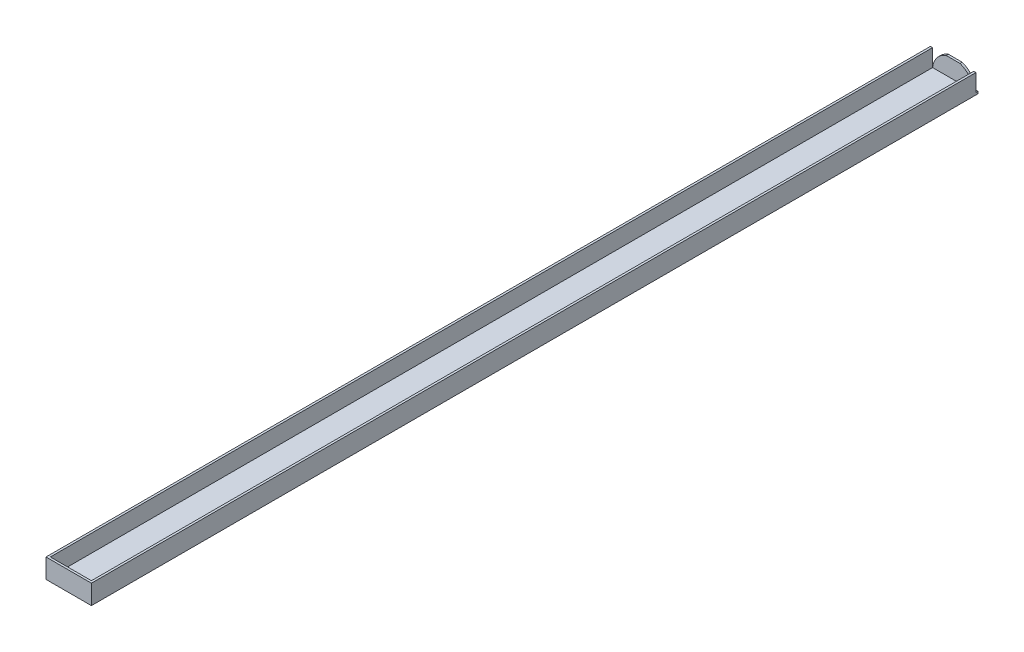
ISO-10303-21;
HEADER;
FILE_DESCRIPTION(('STEP AP214'),'2;1');
FILE_NAME('part.step','',(''),(''),'','','');
FILE_SCHEMA(('AUTOMOTIVE_DESIGN { 1 0 10303 214 1 1 1 1 }'));
ENDSEC;
DATA;
#1=APPLICATION_CONTEXT('core data for automotive mechanical design processes');
#2=APPLICATION_PROTOCOL_DEFINITION('international standard','automotive_design',2000,#1);
#3=PRODUCT_CONTEXT('',#1,'mechanical');
#4=PRODUCT('Part','Part','',(#3));
#5=PRODUCT_RELATED_PRODUCT_CATEGORY('part','',(#4));
#6=PRODUCT_DEFINITION_FORMATION('','',#4);
#7=PRODUCT_DEFINITION_CONTEXT('part definition',#1,'design');
#8=PRODUCT_DEFINITION('design','',#6,#7);
#9=PRODUCT_DEFINITION_SHAPE('','',#8);
#10=(LENGTH_UNIT() NAMED_UNIT(*) SI_UNIT(.MILLI.,.METRE.));
#11=(NAMED_UNIT(*) PLANE_ANGLE_UNIT() SI_UNIT($,.RADIAN.));
#12=(NAMED_UNIT(*) SI_UNIT($,.STERADIAN.) SOLID_ANGLE_UNIT());
#13=UNCERTAINTY_MEASURE_WITH_UNIT(LENGTH_MEASURE(1.E-05),#10,'distance_accuracy_value','');
#14=(GEOMETRIC_REPRESENTATION_CONTEXT(3) GLOBAL_UNCERTAINTY_ASSIGNED_CONTEXT((#13)) GLOBAL_UNIT_ASSIGNED_CONTEXT((#10,
#11,#12)) REPRESENTATION_CONTEXT('',''));
#15=CARTESIAN_POINT('',(0.,0.,0.));
#16=DIRECTION('',(0.,0.,1.));
#17=DIRECTION('',(1.,0.,0.));
#18=AXIS2_PLACEMENT_3D('',#15,#16,#17);
#19=CARTESIAN_POINT('',(0.,0.,410.));
#20=DIRECTION('',(0.,-1.,0.));
#21=DIRECTION('',(0.,0.,-1.));
#22=AXIS2_PLACEMENT_3D('',#19,#20,#21);
#23=PLANE('',#22);
#24=DIRECTION('',(-1.,0.,0.));
#25=VECTOR('',#24,1.);
#26=CARTESIAN_POINT('',(1.,0.,1.));
#27=LINE('',#26,#25);
#28=CARTESIAN_POINT('',(13.682887931237,0.,1.));
#29=VERTEX_POINT('',#28);
#30=CARTESIAN_POINT('',(7.31711206876305,0.,1.));
#31=VERTEX_POINT('',#30);
#32=EDGE_CURVE('E252',#29,#31,#27,.T.);
#33=ORIENTED_EDGE('',*,*,#32,.F.);
#34=DIRECTION('',(0.,0.,-1.));
#35=VECTOR('',#34,1.);
#36=CARTESIAN_POINT('',(13.682887931237,0.,8.));
#37=LINE('',#36,#35);
#38=CARTESIAN_POINT('',(13.682887931237,0.,0.));
#39=VERTEX_POINT('',#38);
#40=EDGE_CURVE('E230',#29,#39,#37,.T.);
#41=ORIENTED_EDGE('',*,*,#40,.T.);
#42=DIRECTION('',(-1.,0.,0.));
#43=VECTOR('',#42,1.);
#44=CARTESIAN_POINT('',(0.,0.,0.));
#45=LINE('',#44,#43);
#46=CARTESIAN_POINT('',(7.31711206876305,0.,0.));
#47=VERTEX_POINT('',#46);
#48=EDGE_CURVE('E193',#39,#47,#45,.T.);
#49=ORIENTED_EDGE('',*,*,#48,.T.);
#50=DIRECTION('',(0.,0.,-1.));
#51=VECTOR('',#50,1.);
#52=CARTESIAN_POINT('',(7.31711206876305,0.,8.));
#53=LINE('',#52,#51);
#54=EDGE_CURVE('E318',#31,#47,#53,.T.);
#55=ORIENTED_EDGE('',*,*,#54,.F.);
#56=EDGE_LOOP('',(#33,#41,#49,#55));
#57=FACE_BOUND('',#56,.T.);
#58=ADVANCED_FACE('F35',(#57),#23,.F.);
#59=CARTESIAN_POINT('',(0.,0.,410.));
#60=DIRECTION('',(1.,0.,0.));
#61=DIRECTION('',(0.,1.,0.));
#62=AXIS2_PLACEMENT_3D('',#59,#60,#61);
#63=PLANE('',#62);
#64=DIRECTION('',(0.,0.,-1.));
#65=VECTOR('',#64,1.);
#66=CARTESIAN_POINT('',(0.,0.,410.));
#67=LINE('',#66,#65);
#68=CARTESIAN_POINT('',(0.,0.,410.));
#69=VERTEX_POINT('',#68);
#70=CARTESIAN_POINT('',(0.,0.,1.));
#71=VERTEX_POINT('',#70);
#72=EDGE_CURVE('E197',#69,#71,#67,.T.);
#73=ORIENTED_EDGE('',*,*,#72,.T.);
#74=DIRECTION('',(0.,1.,0.));
#75=VECTOR('',#74,1.);
#76=CARTESIAN_POINT('',(0.,0.,1.));
#77=LINE('',#76,#75);
#78=CARTESIAN_POINT('',(0.,-8.,1.));
#79=VERTEX_POINT('',#78);
#80=EDGE_CURVE('E169',#79,#71,#77,.T.);
#81=ORIENTED_EDGE('',*,*,#80,.F.);
#82=DIRECTION('',(0.,0.,1.));
#83=VECTOR('',#82,1.);
#84=CARTESIAN_POINT('',(0.,-8.,0.));
#85=LINE('',#84,#83);
#86=CARTESIAN_POINT('',(0.,-8.,0.));
#87=VERTEX_POINT('',#86);
#88=EDGE_CURVE('E161',#87,#79,#85,.T.);
#89=ORIENTED_EDGE('',*,*,#88,.F.);
#90=DIRECTION('',(0.,-1.,0.));
#91=VECTOR('',#90,1.);
#92=CARTESIAN_POINT('',(0.,0.,0.));
#93=LINE('',#92,#91);
#94=CARTESIAN_POINT('',(0.,-9.,0.));
#95=VERTEX_POINT('',#94);
#96=EDGE_CURVE('E174',#87,#95,#93,.T.);
#97=ORIENTED_EDGE('',*,*,#96,.T.);
#98=DIRECTION('',(0.,0.,-1.));
#99=VECTOR('',#98,1.);
#100=CARTESIAN_POINT('',(0.,-9.,410.));
#101=LINE('',#100,#99);
#102=CARTESIAN_POINT('',(0.,-9.,410.));
#103=VERTEX_POINT('',#102);
#104=EDGE_CURVE('E205',#103,#95,#101,.T.);
#105=ORIENTED_EDGE('',*,*,#104,.F.);
#106=DIRECTION('',(0.,-1.,0.));
#107=VECTOR('',#106,1.);
#108=CARTESIAN_POINT('',(0.,0.,410.));
#109=LINE('',#108,#107);
#110=EDGE_CURVE('E196',#69,#103,#109,.T.);
#111=ORIENTED_EDGE('',*,*,#110,.F.);
#112=EDGE_LOOP('',(#73,#81,#89,#97,#105,#111));
#113=FACE_BOUND('',#112,.T.);
#114=ADVANCED_FACE('F37',(#113),#63,.F.);
#115=CARTESIAN_POINT('',(0.,-9.,410.));
#116=DIRECTION('',(0.,1.,0.));
#117=DIRECTION('',(0.,0.,1.));
#118=AXIS2_PLACEMENT_3D('',#115,#116,#117);
#119=PLANE('',#118);
#120=DIRECTION('',(1.,0.,0.));
#121=VECTOR('',#120,1.);
#122=CARTESIAN_POINT('',(0.,-9.,0.));
#123=LINE('',#122,#121);
#124=CARTESIAN_POINT('',(21.,-9.,0.));
#125=VERTEX_POINT('',#124);
#126=EDGE_CURVE('E179',#95,#125,#123,.T.);
#127=ORIENTED_EDGE('',*,*,#126,.T.);
#128=DIRECTION('',(0.,0.,-1.));
#129=VECTOR('',#128,1.);
#130=CARTESIAN_POINT('',(21.,-9.,410.));
#131=LINE('',#130,#129);
#132=CARTESIAN_POINT('',(21.,-9.,410.));
#133=VERTEX_POINT('',#132);
#134=EDGE_CURVE('E202',#133,#125,#131,.T.);
#135=ORIENTED_EDGE('',*,*,#134,.F.);
#136=DIRECTION('',(1.,0.,0.));
#137=VECTOR('',#136,1.);
#138=CARTESIAN_POINT('',(0.,-9.,410.));
#139=LINE('',#138,#137);
#140=EDGE_CURVE('E259',#103,#133,#139,.T.);
#141=ORIENTED_EDGE('',*,*,#140,.F.);
#142=ORIENTED_EDGE('',*,*,#104,.T.);
#143=EDGE_LOOP('',(#127,#135,#141,#142));
#144=FACE_BOUND('',#143,.T.);
#145=ADVANCED_FACE('F274',(#144),#119,.F.);
#146=CARTESIAN_POINT('',(21.,0.,410.));
#147=DIRECTION('',(-1.,0.,0.));
#148=DIRECTION('',(0.,-1.,0.));
#149=AXIS2_PLACEMENT_3D('',#146,#147,#148);
#150=PLANE('',#149);
#151=DIRECTION('',(0.,1.,0.));
#152=VECTOR('',#151,1.);
#153=CARTESIAN_POINT('',(21.,0.,0.));
#154=LINE('',#153,#152);
#155=CARTESIAN_POINT('',(21.,-8.,0.));
#156=VERTEX_POINT('',#155);
#157=EDGE_CURVE('E183',#125,#156,#154,.T.);
#158=ORIENTED_EDGE('',*,*,#157,.T.);
#159=DIRECTION('',(0.,0.,-1.));
#160=VECTOR('',#159,1.);
#161=CARTESIAN_POINT('',(21.,-8.,0.));
#162=LINE('',#161,#160);
#163=CARTESIAN_POINT('',(21.,-8.,0.999999999999999));
#164=VERTEX_POINT('',#163);
#165=EDGE_CURVE('E285',#164,#156,#162,.T.);
#166=ORIENTED_EDGE('',*,*,#165,.F.);
#167=DIRECTION('',(0.,-1.,0.));
#168=VECTOR('',#167,1.);
#169=CARTESIAN_POINT('',(21.,0.,1.));
#170=LINE('',#169,#168);
#171=CARTESIAN_POINT('',(21.,0.,1.));
#172=VERTEX_POINT('',#171);
#173=EDGE_CURVE('E280',#172,#164,#170,.T.);
#174=ORIENTED_EDGE('',*,*,#173,.F.);
#175=DIRECTION('',(0.,0.,-1.));
#176=VECTOR('',#175,1.);
#177=CARTESIAN_POINT('',(21.,0.,410.));
#178=LINE('',#177,#176);
#179=CARTESIAN_POINT('',(21.,0.,410.));
#180=VERTEX_POINT('',#179);
#181=EDGE_CURVE('E199',#180,#172,#178,.T.);
#182=ORIENTED_EDGE('',*,*,#181,.F.);
#183=DIRECTION('',(0.,1.,0.));
#184=VECTOR('',#183,1.);
#185=CARTESIAN_POINT('',(21.,0.,410.));
#186=LINE('',#185,#184);
#187=EDGE_CURVE('E260',#133,#180,#186,.T.);
#188=ORIENTED_EDGE('',*,*,#187,.F.);
#189=ORIENTED_EDGE('',*,*,#134,.T.);
#190=EDGE_LOOP('',(#158,#166,#174,#182,#188,#189));
#191=FACE_BOUND('',#190,.T.);
#192=ADVANCED_FACE('F277',(#191),#150,.F.);
#193=DIRECTION('',(0.,0.,1.));
#194=VECTOR('',#193,1.);
#195=CARTESIAN_POINT('',(1.,0.,1.));
#196=LINE('',#195,#194);
#197=CARTESIAN_POINT('',(0.999999999999999,0.,1.));
#198=VERTEX_POINT('',#197);
#199=CARTESIAN_POINT('',(1.00000000000005,0.,409.));
#200=VERTEX_POINT('',#199);
#201=EDGE_CURVE('E243',#198,#200,#196,.T.);
#202=ORIENTED_EDGE('',*,*,#201,.F.);
#203=DIRECTION('',(-1.,0.,0.));
#204=VECTOR('',#203,1.);
#205=CARTESIAN_POINT('',(9.06225774829855,0.,1.));
#206=LINE('',#205,#204);
#207=EDGE_CURVE('E272',#198,#71,#206,.T.);
#208=ORIENTED_EDGE('',*,*,#207,.T.);
#209=ORIENTED_EDGE('',*,*,#72,.F.);
#210=DIRECTION('',(-1.,0.,0.));
#211=VECTOR('',#210,1.);
#212=CARTESIAN_POINT('',(0.,0.,410.));
#213=LINE('',#212,#211);
#214=EDGE_CURVE('E188',#180,#69,#213,.T.);
#215=ORIENTED_EDGE('',*,*,#214,.F.);
#216=ORIENTED_EDGE('',*,*,#181,.T.);
#217=DIRECTION('',(1.,0.,0.));
#218=VECTOR('',#217,1.);
#219=CARTESIAN_POINT('',(11.9377422517014,0.,1.));
#220=LINE('',#219,#218);
#221=CARTESIAN_POINT('',(20.,0.,1.));
#222=VERTEX_POINT('',#221);
#223=EDGE_CURVE('E283',#222,#172,#220,.T.);
#224=ORIENTED_EDGE('',*,*,#223,.F.);
#225=DIRECTION('',(0.,0.,-1.));
#226=VECTOR('',#225,1.);
#227=CARTESIAN_POINT('',(20.,0.,1.));
#228=LINE('',#227,#226);
#229=CARTESIAN_POINT('',(20.,0.,409.));
#230=VERTEX_POINT('',#229);
#231=EDGE_CURVE('E249',#230,#222,#228,.T.);
#232=ORIENTED_EDGE('',*,*,#231,.F.);
#233=DIRECTION('',(1.,0.,0.));
#234=VECTOR('',#233,1.);
#235=CARTESIAN_POINT('',(1.00000000000005,0.,409.));
#236=LINE('',#235,#234);
#237=EDGE_CURVE('E245',#200,#230,#236,.T.);
#238=ORIENTED_EDGE('',*,*,#237,.F.);
#239=EDGE_LOOP('',(#202,#208,#209,#215,#216,#224,#232,#238));
#240=FACE_BOUND('',#239,.T.);
#241=ADVANCED_FACE('F271',(#240),#23,.F.);
#242=CARTESIAN_POINT('',(0.,0.,410.));
#243=DIRECTION('',(0.,0.,1.));
#244=DIRECTION('',(1.,0.,0.));
#245=AXIS2_PLACEMENT_3D('',#242,#243,#244);
#246=PLANE('',#245);
#247=ORIENTED_EDGE('',*,*,#110,.T.);
#248=ORIENTED_EDGE('',*,*,#140,.T.);
#249=ORIENTED_EDGE('',*,*,#187,.T.);
#250=ORIENTED_EDGE('',*,*,#214,.T.);
#251=EDGE_LOOP('',(#247,#248,#249,#250));
#252=FACE_BOUND('',#251,.T.);
#253=ADVANCED_FACE('F266',(#252),#246,.T.);
#254=CARTESIAN_POINT('',(0.,0.,0.));
#255=DIRECTION('',(0.,0.,1.));
#256=DIRECTION('',(1.,0.,0.));
#257=AXIS2_PLACEMENT_3D('',#254,#255,#256);
#258=PLANE('',#257);
#259=ORIENTED_EDGE('',*,*,#96,.F.);
#260=DIRECTION('',(-1.,0.,0.));
#261=VECTOR('',#260,1.);
#262=CARTESIAN_POINT('',(9.06225774829855,-8.,0.));
#263=LINE('',#262,#261);
#264=CARTESIAN_POINT('',(0.999999999999999,-8.,0.));
#265=VERTEX_POINT('',#264);
#266=EDGE_CURVE('E158',#265,#87,#263,.T.);
#267=ORIENTED_EDGE('',*,*,#266,.F.);
#268=DIRECTION('',(0.,1.,0.));
#269=VECTOR('',#268,1.);
#270=CARTESIAN_POINT('',(1.,-8.06150355205048,0.));
#271=LINE('',#270,#269);
#272=CARTESIAN_POINT('',(1.,-8.06150355205048,0.));
#273=VERTEX_POINT('',#272);
#274=EDGE_CURVE('E327',#273,#265,#271,.T.);
#275=ORIENTED_EDGE('',*,*,#274,.F.);
#276=CARTESIAN_POINT('',(10.5,-9.,0.));
#277=DIRECTION('',(0.,0.,1.));
#278=DIRECTION('',(-1.,0.,0.));
#279=AXIS2_PLACEMENT_3D('',#276,#277,#278);
#280=CIRCLE('',#279,9.54624405631942);
#281=EDGE_CURVE('E308',#47,#273,#280,.T.);
#282=ORIENTED_EDGE('',*,*,#281,.F.);
#283=ORIENTED_EDGE('',*,*,#48,.F.);
#284=CARTESIAN_POINT('',(10.5,-9.,0.));
#285=DIRECTION('',(0.,0.,1.));
#286=DIRECTION('',(1.,0.,0.));
#287=AXIS2_PLACEMENT_3D('',#284,#285,#286);
#288=CIRCLE('',#287,9.54624405631942);
#289=CARTESIAN_POINT('',(20.,-8.06150355205048,0.));
#290=VERTEX_POINT('',#289);
#291=EDGE_CURVE('E316',#290,#39,#288,.T.);
#292=ORIENTED_EDGE('',*,*,#291,.F.);
#293=DIRECTION('',(0.,-1.,0.));
#294=VECTOR('',#293,1.);
#295=CARTESIAN_POINT('',(20.,-8.06150355205048,0.));
#296=LINE('',#295,#294);
#297=CARTESIAN_POINT('',(20.,-8.,0.));
#298=VERTEX_POINT('',#297);
#299=EDGE_CURVE('E314',#298,#290,#296,.T.);
#300=ORIENTED_EDGE('',*,*,#299,.F.);
#301=DIRECTION('',(1.,0.,0.));
#302=VECTOR('',#301,1.);
#303=CARTESIAN_POINT('',(11.9377422517014,-8.,0.));
#304=LINE('',#303,#302);
#305=EDGE_CURVE('E306',#298,#156,#304,.T.);
#306=ORIENTED_EDGE('',*,*,#305,.T.);
#307=ORIENTED_EDGE('',*,*,#157,.F.);
#308=ORIENTED_EDGE('',*,*,#126,.F.);
#309=EDGE_LOOP('',(#259,#267,#275,#282,#283,#292,#300,#306,#307,#308));
#310=FACE_BOUND('',#309,.T.);
#311=ADVANCED_FACE('F177',(#310),#258,.F.);
#312=CARTESIAN_POINT('',(1.,-8.,1.));
#313=DIRECTION('',(-1.,0.,0.));
#314=DIRECTION('',(0.,0.,1.));
#315=AXIS2_PLACEMENT_3D('',#312,#313,#314);
#316=PLANE('',#315);
#317=DIRECTION('',(0.,0.,-1.));
#318=VECTOR('',#317,1.);
#319=CARTESIAN_POINT('',(0.999999999999999,-8.,0.));
#320=LINE('',#319,#318);
#321=CARTESIAN_POINT('',(1.,-8.,1.));
#322=VERTEX_POINT('',#321);
#323=EDGE_CURVE('E164',#322,#265,#320,.T.);
#324=ORIENTED_EDGE('',*,*,#323,.F.);
#325=DIRECTION('',(0.,-1.,0.));
#326=VECTOR('',#325,1.);
#327=CARTESIAN_POINT('',(0.999999999999999,0.,1.));
#328=LINE('',#327,#326);
#329=EDGE_CURVE('E296',#198,#322,#328,.T.);
#330=ORIENTED_EDGE('',*,*,#329,.F.);
#331=ORIENTED_EDGE('',*,*,#201,.T.);
#332=DIRECTION('',(0.,1.,0.));
#333=VECTOR('',#332,1.);
#334=CARTESIAN_POINT('',(1.00000000000005,-8.,409.));
#335=LINE('',#334,#333);
#336=CARTESIAN_POINT('',(1.00000000000005,-8.,409.));
#337=VERTEX_POINT('',#336);
#338=EDGE_CURVE('E185',#337,#200,#335,.T.);
#339=ORIENTED_EDGE('',*,*,#338,.F.);
#340=DIRECTION('',(0.,0.,1.));
#341=VECTOR('',#340,1.);
#342=CARTESIAN_POINT('',(1.,-8.,1.));
#343=LINE('',#342,#341);
#344=CARTESIAN_POINT('',(1.,-8.,8.));
#345=VERTEX_POINT('',#344);
#346=EDGE_CURVE('E239',#345,#337,#343,.T.);
#347=ORIENTED_EDGE('',*,*,#346,.F.);
#348=DIRECTION('',(0.,1.,0.));
#349=VECTOR('',#348,1.);
#350=CARTESIAN_POINT('',(1.,-8.06150355205048,8.));
#351=LINE('',#350,#349);
#352=CARTESIAN_POINT('',(1.,-8.06150355205048,8.));
#353=VERTEX_POINT('',#352);
#354=EDGE_CURVE('E326',#353,#345,#351,.T.);
#355=ORIENTED_EDGE('',*,*,#354,.F.);
#356=DIRECTION('',(0.,0.,-1.));
#357=VECTOR('',#356,1.);
#358=CARTESIAN_POINT('',(1.,-8.06150355205048,8.));
#359=LINE('',#358,#357);
#360=EDGE_CURVE('E329',#353,#273,#359,.T.);
#361=ORIENTED_EDGE('',*,*,#360,.T.);
#362=ORIENTED_EDGE('',*,*,#274,.T.);
#363=EDGE_LOOP('',(#324,#330,#331,#339,#347,#355,#361,#362));
#364=FACE_BOUND('',#363,.T.);
#365=ADVANCED_FACE('F294',(#364),#316,.F.);
#366=CARTESIAN_POINT('',(1.,-8.,1.));
#367=DIRECTION('',(0.,0.,-1.));
#368=DIRECTION('',(-1.,0.,0.));
#369=AXIS2_PLACEMENT_3D('',#366,#367,#368);
#370=PLANE('',#369);
#371=DIRECTION('',(-1.,0.,0.));
#372=VECTOR('',#371,1.);
#373=CARTESIAN_POINT('',(1.,-8.,1.));
#374=LINE('',#373,#372);
#375=CARTESIAN_POINT('',(19.9937229569234,-8.,1.));
#376=VERTEX_POINT('',#375);
#377=CARTESIAN_POINT('',(1.00627704307663,-8.,1.));
#378=VERTEX_POINT('',#377);
#379=EDGE_CURVE('E235',#376,#378,#374,.T.);
#380=ORIENTED_EDGE('',*,*,#379,.F.);
#381=CARTESIAN_POINT('',(10.5,-9.,1.));
#382=DIRECTION('',(0.,0.,-1.));
#383=DIRECTION('',(-1.,0.,0.));
#384=AXIS2_PLACEMENT_3D('',#381,#382,#383);
#385=CIRCLE('',#384,9.54624405631942);
#386=EDGE_CURVE('E246',#376,#29,#385,.F.);
#387=ORIENTED_EDGE('',*,*,#386,.T.);
#388=ORIENTED_EDGE('',*,*,#32,.T.);
#389=CARTESIAN_POINT('',(10.5,-9.,1.));
#390=DIRECTION('',(0.,0.,-1.));
#391=DIRECTION('',(-1.,0.,0.));
#392=AXIS2_PLACEMENT_3D('',#389,#390,#391);
#393=CIRCLE('',#392,9.54624405631942);
#394=EDGE_CURVE('E321',#31,#378,#393,.F.);
#395=ORIENTED_EDGE('',*,*,#394,.T.);
#396=EDGE_LOOP('',(#380,#387,#388,#395));
#397=FACE_BOUND('',#396,.T.);
#398=ADVANCED_FACE('F356',(#397),#370,.F.);
#399=CARTESIAN_POINT('',(20.,-8.,1.));
#400=DIRECTION('',(1.,0.,0.));
#401=DIRECTION('',(0.,0.,-1.));
#402=AXIS2_PLACEMENT_3D('',#399,#400,#401);
#403=PLANE('',#402);
#404=DIRECTION('',(0.,1.,0.));
#405=VECTOR('',#404,1.);
#406=CARTESIAN_POINT('',(20.,0.,1.));
#407=LINE('',#406,#405);
#408=CARTESIAN_POINT('',(20.,-8.,0.999999999999999));
#409=VERTEX_POINT('',#408);
#410=EDGE_CURVE('E288',#409,#222,#407,.T.);
#411=ORIENTED_EDGE('',*,*,#410,.F.);
#412=DIRECTION('',(0.,0.,1.));
#413=VECTOR('',#412,1.);
#414=CARTESIAN_POINT('',(20.,-8.,0.));
#415=LINE('',#414,#413);
#416=EDGE_CURVE('E305',#298,#409,#415,.T.);
#417=ORIENTED_EDGE('',*,*,#416,.F.);
#418=ORIENTED_EDGE('',*,*,#299,.T.);
#419=DIRECTION('',(0.,0.,-1.));
#420=VECTOR('',#419,1.);
#421=CARTESIAN_POINT('',(20.,-8.06150355205048,8.));
#422=LINE('',#421,#420);
#423=CARTESIAN_POINT('',(20.,-8.06150355205048,8.));
#424=VERTEX_POINT('',#423);
#425=EDGE_CURVE('E229',#424,#290,#422,.T.);
#426=ORIENTED_EDGE('',*,*,#425,.F.);
#427=DIRECTION('',(0.,-1.,0.));
#428=VECTOR('',#427,1.);
#429=CARTESIAN_POINT('',(20.,-8.06150355205048,8.));
#430=LINE('',#429,#428);
#431=CARTESIAN_POINT('',(20.,-8.,8.));
#432=VERTEX_POINT('',#431);
#433=EDGE_CURVE('E215',#432,#424,#430,.T.);
#434=ORIENTED_EDGE('',*,*,#433,.F.);
#435=DIRECTION('',(0.,0.,-1.));
#436=VECTOR('',#435,1.);
#437=CARTESIAN_POINT('',(20.,-8.,1.));
#438=LINE('',#437,#436);
#439=CARTESIAN_POINT('',(20.,-8.,409.));
#440=VERTEX_POINT('',#439);
#441=EDGE_CURVE('E226',#440,#432,#438,.T.);
#442=ORIENTED_EDGE('',*,*,#441,.F.);
#443=DIRECTION('',(0.,1.,0.));
#444=VECTOR('',#443,1.);
#445=CARTESIAN_POINT('',(20.,-8.,409.));
#446=LINE('',#445,#444);
#447=EDGE_CURVE('E181',#440,#230,#446,.T.);
#448=ORIENTED_EDGE('',*,*,#447,.T.);
#449=ORIENTED_EDGE('',*,*,#231,.T.);
#450=EDGE_LOOP('',(#411,#417,#418,#426,#434,#442,#448,#449));
#451=FACE_BOUND('',#450,.T.);
#452=ADVANCED_FACE('F225',(#451),#403,.F.);
#453=CARTESIAN_POINT('',(1.00000000000005,-8.,409.));
#454=DIRECTION('',(0.,0.,1.));
#455=DIRECTION('',(1.,0.,0.));
#456=AXIS2_PLACEMENT_3D('',#453,#454,#455);
#457=PLANE('',#456);
#458=ORIENTED_EDGE('',*,*,#237,.T.);
#459=ORIENTED_EDGE('',*,*,#447,.F.);
#460=DIRECTION('',(1.,0.,0.));
#461=VECTOR('',#460,1.);
#462=CARTESIAN_POINT('',(1.00000000000005,-8.,409.));
#463=LINE('',#462,#461);
#464=EDGE_CURVE('E234',#337,#440,#463,.T.);
#465=ORIENTED_EDGE('',*,*,#464,.F.);
#466=ORIENTED_EDGE('',*,*,#338,.T.);
#467=EDGE_LOOP('',(#458,#459,#465,#466));
#468=FACE_BOUND('',#467,.T.);
#469=ADVANCED_FACE('F290',(#468),#457,.F.);
#470=CARTESIAN_POINT('',(0.,-8.,0.));
#471=DIRECTION('',(0.,1.,0.));
#472=DIRECTION('',(0.,0.,1.));
#473=AXIS2_PLACEMENT_3D('',#470,#471,#472);
#474=PLANE('',#473);
#475=DIRECTION('',(0.,0.,-1.));
#476=VECTOR('',#475,1.);
#477=CARTESIAN_POINT('',(19.9937229569234,-8.,8.));
#478=LINE('',#477,#476);
#479=CARTESIAN_POINT('',(19.9937229569234,-8.,8.));
#480=VERTEX_POINT('',#479);
#481=EDGE_CURVE('E11',#376,#480,#478,.F.);
#482=ORIENTED_EDGE('',*,*,#481,.F.);
#483=ORIENTED_EDGE('',*,*,#379,.T.);
#484=DIRECTION('',(0.,0.,-1.));
#485=VECTOR('',#484,1.);
#486=CARTESIAN_POINT('',(1.00627704307663,-8.,8.));
#487=LINE('',#486,#485);
#488=CARTESIAN_POINT('',(1.00627704307663,-8.,8.));
#489=VERTEX_POINT('',#488);
#490=EDGE_CURVE('E210',#489,#378,#487,.T.);
#491=ORIENTED_EDGE('',*,*,#490,.F.);
#492=DIRECTION('',(-1.,0.,0.));
#493=VECTOR('',#492,1.);
#494=CARTESIAN_POINT('',(0.,-8.,8.));
#495=LINE('',#494,#493);
#496=EDGE_CURVE('E207',#489,#345,#495,.T.);
#497=ORIENTED_EDGE('',*,*,#496,.T.);
#498=ORIENTED_EDGE('',*,*,#346,.T.);
#499=ORIENTED_EDGE('',*,*,#464,.T.);
#500=ORIENTED_EDGE('',*,*,#441,.T.);
#501=DIRECTION('',(1.,0.,0.));
#502=VECTOR('',#501,1.);
#503=CARTESIAN_POINT('',(0.,-8.,8.));
#504=LINE('',#503,#502);
#505=EDGE_CURVE('E43',#480,#432,#504,.T.);
#506=ORIENTED_EDGE('',*,*,#505,.F.);
#507=EDGE_LOOP('',(#482,#483,#491,#497,#498,#499,#500,#506));
#508=FACE_BOUND('',#507,.T.);
#509=ADVANCED_FACE('F232',(#508),#474,.T.);
#510=CARTESIAN_POINT('',(10.5,-9.,8.));
#511=DIRECTION('',(0.,0.,-1.));
#512=DIRECTION('',(-1.,0.,0.));
#513=AXIS2_PLACEMENT_3D('',#510,#511,#512);
#514=CYLINDRICAL_SURFACE('',#513,9.54624405631942);
#515=ORIENTED_EDGE('',*,*,#54,.T.);
#516=ORIENTED_EDGE('',*,*,#281,.T.);
#517=ORIENTED_EDGE('',*,*,#360,.F.);
#518=CARTESIAN_POINT('',(10.5,-9.,8.));
#519=DIRECTION('',(0.,0.,1.));
#520=DIRECTION('',(-1.,0.,0.));
#521=AXIS2_PLACEMENT_3D('',#518,#519,#520);
#522=CIRCLE('',#521,9.54624405631942);
#523=EDGE_CURVE('E324',#489,#353,#522,.T.);
#524=ORIENTED_EDGE('',*,*,#523,.F.);
#525=ORIENTED_EDGE('',*,*,#490,.T.);
#526=ORIENTED_EDGE('',*,*,#394,.F.);
#527=EDGE_LOOP('',(#515,#516,#517,#524,#525,#526));
#528=FACE_BOUND('',#527,.T.);
#529=ADVANCED_FACE('F345',(#528),#514,.T.);
#530=CARTESIAN_POINT('',(10.5,-9.,8.));
#531=DIRECTION('',(0.,0.,-1.));
#532=DIRECTION('',(-1.,0.,0.));
#533=AXIS2_PLACEMENT_3D('',#530,#531,#532);
#534=PLANE('',#533);
#535=ORIENTED_EDGE('',*,*,#523,.T.);
#536=ORIENTED_EDGE('',*,*,#354,.T.);
#537=ORIENTED_EDGE('',*,*,#496,.F.);
#538=EDGE_LOOP('',(#535,#536,#537));
#539=FACE_BOUND('',#538,.T.);
#540=ADVANCED_FACE('F342',(#539),#534,.T.);
#541=CARTESIAN_POINT('',(10.5,-9.,8.));
#542=DIRECTION('',(0.,0.,-1.));
#543=DIRECTION('',(-1.,0.,0.));
#544=AXIS2_PLACEMENT_3D('',#541,#542,#543);
#545=CYLINDRICAL_SURFACE('',#544,9.54624405631942);
#546=ORIENTED_EDGE('',*,*,#481,.T.);
#547=CARTESIAN_POINT('',(10.5,-9.,8.));
#548=DIRECTION('',(0.,0.,1.));
#549=DIRECTION('',(1.,0.,0.));
#550=AXIS2_PLACEMENT_3D('',#547,#548,#549);
#551=CIRCLE('',#550,9.54624405631942);
#552=EDGE_CURVE('E218',#424,#480,#551,.T.);
#553=ORIENTED_EDGE('',*,*,#552,.F.);
#554=ORIENTED_EDGE('',*,*,#425,.T.);
#555=ORIENTED_EDGE('',*,*,#291,.T.);
#556=ORIENTED_EDGE('',*,*,#40,.F.);
#557=ORIENTED_EDGE('',*,*,#386,.F.);
#558=EDGE_LOOP('',(#546,#553,#554,#555,#556,#557));
#559=FACE_BOUND('',#558,.T.);
#560=ADVANCED_FACE('F353',(#559),#545,.T.);
#561=CARTESIAN_POINT('',(10.5,-9.,8.));
#562=DIRECTION('',(0.,0.,1.));
#563=DIRECTION('',(1.,0.,0.));
#564=AXIS2_PLACEMENT_3D('',#561,#562,#563);
#565=PLANE('',#564);
#566=ORIENTED_EDGE('',*,*,#505,.T.);
#567=ORIENTED_EDGE('',*,*,#433,.T.);
#568=ORIENTED_EDGE('',*,*,#552,.T.);
#569=EDGE_LOOP('',(#566,#567,#568));
#570=FACE_BOUND('',#569,.T.);
#571=ADVANCED_FACE('F214',(#570),#565,.F.);
#572=CARTESIAN_POINT('',(11.9377422517014,-8.,0.));
#573=DIRECTION('',(0.,-1.,0.));
#574=DIRECTION('',(1.,0.,0.));
#575=AXIS2_PLACEMENT_3D('',#572,#573,#574);
#576=PLANE('',#575);
#577=ORIENTED_EDGE('',*,*,#416,.T.);
#578=DIRECTION('',(1.,0.,0.));
#579=VECTOR('',#578,1.);
#580=CARTESIAN_POINT('',(11.9377422517014,-8.,0.999999999999999));
#581=LINE('',#580,#579);
#582=EDGE_CURVE('E58',#409,#164,#581,.T.);
#583=ORIENTED_EDGE('',*,*,#582,.T.);
#584=ORIENTED_EDGE('',*,*,#165,.T.);
#585=ORIENTED_EDGE('',*,*,#305,.F.);
#586=EDGE_LOOP('',(#577,#583,#584,#585));
#587=FACE_BOUND('',#586,.T.);
#588=ADVANCED_FACE('F359',(#587),#576,.F.);
#589=CARTESIAN_POINT('',(11.9377422517014,0.,1.));
#590=DIRECTION('',(0.,0.,1.));
#591=DIRECTION('',(0.,-1.,0.));
#592=AXIS2_PLACEMENT_3D('',#589,#590,#591);
#593=PLANE('',#592);
#594=ORIENTED_EDGE('',*,*,#410,.T.);
#595=ORIENTED_EDGE('',*,*,#223,.T.);
#596=ORIENTED_EDGE('',*,*,#173,.T.);
#597=ORIENTED_EDGE('',*,*,#582,.F.);
#598=EDGE_LOOP('',(#594,#595,#596,#597));
#599=FACE_BOUND('',#598,.T.);
#600=ADVANCED_FACE('F360',(#599),#593,.F.);
#601=CARTESIAN_POINT('',(9.06225774829855,0.,1.));
#602=DIRECTION('',(0.,0.,1.));
#603=DIRECTION('',(0.,-1.,0.));
#604=AXIS2_PLACEMENT_3D('',#601,#602,#603);
#605=PLANE('',#604);
#606=ORIENTED_EDGE('',*,*,#329,.T.);
#607=DIRECTION('',(-1.,0.,0.));
#608=VECTOR('',#607,1.);
#609=CARTESIAN_POINT('',(9.06225774829855,-8.,1.));
#610=LINE('',#609,#608);
#611=EDGE_CURVE('E50',#322,#79,#610,.T.);
#612=ORIENTED_EDGE('',*,*,#611,.T.);
#613=ORIENTED_EDGE('',*,*,#80,.T.);
#614=ORIENTED_EDGE('',*,*,#207,.F.);
#615=EDGE_LOOP('',(#606,#612,#613,#614));
#616=FACE_BOUND('',#615,.T.);
#617=ADVANCED_FACE('F362',(#616),#605,.F.);
#618=CARTESIAN_POINT('',(9.06225774829855,-8.,0.));
#619=DIRECTION('',(0.,-1.,0.));
#620=DIRECTION('',(1.,0.,0.));
#621=AXIS2_PLACEMENT_3D('',#618,#619,#620);
#622=PLANE('',#621);
#623=ORIENTED_EDGE('',*,*,#323,.T.);
#624=ORIENTED_EDGE('',*,*,#266,.T.);
#625=ORIENTED_EDGE('',*,*,#88,.T.);
#626=ORIENTED_EDGE('',*,*,#611,.F.);
#627=EDGE_LOOP('',(#623,#624,#625,#626));
#628=FACE_BOUND('',#627,.T.);
#629=ADVANCED_FACE('F160',(#628),#622,.F.);
#630=CLOSED_SHELL('',(#58,#114,#145,#192,#241,#253,#311,#365,#398,#452,#469,#509,#529,#540,#560,
#571,#588,#600,#617,#629));
#631=MANIFOLD_SOLID_BREP('B2',#630);
#632=ADVANCED_BREP_SHAPE_REPRESENTATION('',(#18,#631),#14);
#633=SHAPE_DEFINITION_REPRESENTATION(#9,#632);
ENDSEC;
END-ISO-10303-21;
